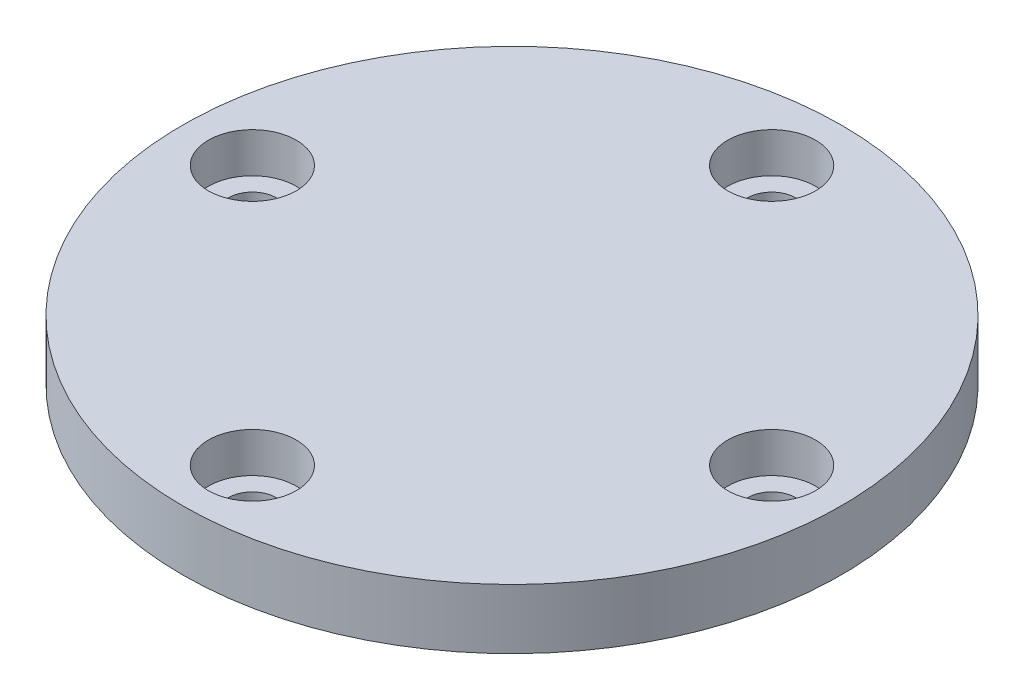
ISO-10303-21;
HEADER;
FILE_DESCRIPTION(('STEP AP214'),'2;1');
FILE_NAME('part.step','',(''),(''),'','','');
FILE_SCHEMA(('AUTOMOTIVE_DESIGN { 1 0 10303 214 1 1 1 1 }'));
ENDSEC;
DATA;
#1=APPLICATION_CONTEXT('core data for automotive mechanical design processes');
#2=APPLICATION_PROTOCOL_DEFINITION('international standard','automotive_design',2000,#1);
#3=PRODUCT_CONTEXT('',#1,'mechanical');
#4=PRODUCT('Part','Part','',(#3));
#5=PRODUCT_RELATED_PRODUCT_CATEGORY('part','',(#4));
#6=PRODUCT_DEFINITION_FORMATION('','',#4);
#7=PRODUCT_DEFINITION_CONTEXT('part definition',#1,'design');
#8=PRODUCT_DEFINITION('design','',#6,#7);
#9=PRODUCT_DEFINITION_SHAPE('','',#8);
#10=(LENGTH_UNIT() NAMED_UNIT(*) SI_UNIT(.MILLI.,.METRE.));
#11=(NAMED_UNIT(*) PLANE_ANGLE_UNIT() SI_UNIT($,.RADIAN.));
#12=(NAMED_UNIT(*) SI_UNIT($,.STERADIAN.) SOLID_ANGLE_UNIT());
#13=UNCERTAINTY_MEASURE_WITH_UNIT(LENGTH_MEASURE(1.E-05),#10,'distance_accuracy_value','');
#14=(GEOMETRIC_REPRESENTATION_CONTEXT(3) GLOBAL_UNCERTAINTY_ASSIGNED_CONTEXT((#13)) GLOBAL_UNIT_ASSIGNED_CONTEXT((#10,
#11,#12)) REPRESENTATION_CONTEXT('',''));
#15=CARTESIAN_POINT('',(0.,0.,0.));
#16=DIRECTION('',(0.,0.,1.));
#17=DIRECTION('',(1.,0.,0.));
#18=AXIS2_PLACEMENT_3D('',#15,#16,#17);
#19=CARTESIAN_POINT('',(0.,3.,0.));
#20=DIRECTION('',(0.,-1.,0.));
#21=DIRECTION('',(0.,0.,-1.));
#22=AXIS2_PLACEMENT_3D('',#19,#20,#21);
#23=CYLINDRICAL_SURFACE('',#22,16.5);
#24=CARTESIAN_POINT('',(0.,3.,0.));
#25=DIRECTION('',(0.,1.,0.));
#26=DIRECTION('',(0.,0.,1.));
#27=AXIS2_PLACEMENT_3D('',#24,#25,#26);
#28=CIRCLE('',#27,16.5);
#29=CARTESIAN_POINT('',(0.,3.,16.5));
#30=VERTEX_POINT('',#29);
#31=EDGE_CURVE('E10',#30,#30,#28,.T.);
#32=ORIENTED_EDGE('',*,*,#31,.F.);
#33=EDGE_LOOP('',(#32));
#34=FACE_BOUND('',#33,.T.);
#35=CARTESIAN_POINT('',(0.,0.,0.));
#36=DIRECTION('',(0.,1.,0.));
#37=DIRECTION('',(0.,0.,1.));
#38=AXIS2_PLACEMENT_3D('',#35,#36,#37);
#39=CIRCLE('',#38,16.5);
#40=CARTESIAN_POINT('',(0.,0.,16.5));
#41=VERTEX_POINT('',#40);
#42=EDGE_CURVE('E37',#41,#41,#39,.T.);
#43=ORIENTED_EDGE('',*,*,#42,.T.);
#44=EDGE_LOOP('',(#43));
#45=FACE_BOUND('',#44,.T.);
#46=ADVANCED_FACE('F34',(#34,#45),#23,.T.);
#47=CARTESIAN_POINT('',(0.,3.,0.));
#48=DIRECTION('',(0.,1.,0.));
#49=DIRECTION('',(0.,0.,1.));
#50=AXIS2_PLACEMENT_3D('',#47,#48,#49);
#51=PLANE('',#50);
#52=CARTESIAN_POINT('',(0.,3.,13.));
#53=DIRECTION('',(0.,1.,0.));
#54=DIRECTION('',(1.,0.,0.));
#55=AXIS2_PLACEMENT_3D('',#52,#53,#54);
#56=CIRCLE('',#55,2.19999999999999);
#57=CARTESIAN_POINT('',(2.20000000000004,3.,13.));
#58=VERTEX_POINT('',#57);
#59=EDGE_CURVE('E74',#58,#58,#56,.T.);
#60=ORIENTED_EDGE('',*,*,#59,.F.);
#61=EDGE_LOOP('',(#60));
#62=FACE_BOUND('',#61,.T.);
#63=CARTESIAN_POINT('',(13.,3.,0.));
#64=DIRECTION('',(0.,1.,0.));
#65=DIRECTION('',(0.,0.,-1.));
#66=AXIS2_PLACEMENT_3D('',#63,#64,#65);
#67=CIRCLE('',#66,2.19999999999999);
#68=CARTESIAN_POINT('',(13.,3.,-2.19999999999999));
#69=VERTEX_POINT('',#68);
#70=EDGE_CURVE('E61',#69,#69,#67,.T.);
#71=ORIENTED_EDGE('',*,*,#70,.F.);
#72=EDGE_LOOP('',(#71));
#73=FACE_BOUND('',#72,.T.);
#74=CARTESIAN_POINT('',(-1.36167772214882E-13,3.,-13.));
#75=DIRECTION('',(0.,1.,0.));
#76=DIRECTION('',(-1.,0.,0.));
#77=AXIS2_PLACEMENT_3D('',#74,#75,#76);
#78=CIRCLE('',#77,2.19999999999999);
#79=CARTESIAN_POINT('',(-2.20000000000013,3.,-13.));
#80=VERTEX_POINT('',#79);
#81=EDGE_CURVE('E68',#80,#80,#78,.T.);
#82=ORIENTED_EDGE('',*,*,#81,.F.);
#83=EDGE_LOOP('',(#82));
#84=FACE_BOUND('',#83,.T.);
#85=CARTESIAN_POINT('',(-13.,3.,0.));
#86=DIRECTION('',(0.,1.,0.));
#87=DIRECTION('',(0.,0.,1.));
#88=AXIS2_PLACEMENT_3D('',#85,#86,#87);
#89=CIRCLE('',#88,2.19999999999999);
#90=CARTESIAN_POINT('',(-13.,3.,2.19999999999999));
#91=VERTEX_POINT('',#90);
#92=EDGE_CURVE('E54',#91,#91,#89,.T.);
#93=ORIENTED_EDGE('',*,*,#92,.F.);
#94=EDGE_LOOP('',(#93));
#95=FACE_BOUND('',#94,.T.);
#96=ORIENTED_EDGE('',*,*,#31,.T.);
#97=EDGE_LOOP('',(#96));
#98=FACE_BOUND('',#97,.T.);
#99=ADVANCED_FACE('F96',(#62,#73,#84,#95,#98),#51,.T.);
#100=CARTESIAN_POINT('',(0.,0.,0.));
#101=DIRECTION('',(0.,1.,0.));
#102=DIRECTION('',(0.,0.,1.));
#103=AXIS2_PLACEMENT_3D('',#100,#101,#102);
#104=PLANE('',#103);
#105=CARTESIAN_POINT('',(0.,0.,13.));
#106=DIRECTION('',(0.,1.,0.));
#107=DIRECTION('',(1.,0.,0.));
#108=AXIS2_PLACEMENT_3D('',#105,#106,#107);
#109=CIRCLE('',#108,1.2);
#110=CARTESIAN_POINT('',(1.20000000000005,0.,13.));
#111=VERTEX_POINT('',#110);
#112=EDGE_CURVE('E88',#111,#111,#109,.T.);
#113=ORIENTED_EDGE('',*,*,#112,.T.);
#114=EDGE_LOOP('',(#113));
#115=FACE_BOUND('',#114,.T.);
#116=CARTESIAN_POINT('',(13.,0.,0.));
#117=DIRECTION('',(0.,1.,0.));
#118=DIRECTION('',(0.,0.,-1.));
#119=AXIS2_PLACEMENT_3D('',#116,#117,#118);
#120=CIRCLE('',#119,1.2);
#121=CARTESIAN_POINT('',(13.,0.,-1.2));
#122=VERTEX_POINT('',#121);
#123=EDGE_CURVE('E78',#122,#122,#120,.T.);
#124=ORIENTED_EDGE('',*,*,#123,.T.);
#125=EDGE_LOOP('',(#124));
#126=FACE_BOUND('',#125,.T.);
#127=CARTESIAN_POINT('',(-1.36167772214882E-13,0.,-13.));
#128=DIRECTION('',(0.,1.,0.));
#129=DIRECTION('',(-1.,0.,0.));
#130=AXIS2_PLACEMENT_3D('',#127,#128,#129);
#131=CIRCLE('',#130,1.2);
#132=CARTESIAN_POINT('',(-1.20000000000014,0.,-13.));
#133=VERTEX_POINT('',#132);
#134=EDGE_CURVE('E65',#133,#133,#131,.T.);
#135=ORIENTED_EDGE('',*,*,#134,.T.);
#136=EDGE_LOOP('',(#135));
#137=FACE_BOUND('',#136,.T.);
#138=CARTESIAN_POINT('',(-13.,0.,0.));
#139=DIRECTION('',(0.,1.,0.));
#140=DIRECTION('',(0.,0.,1.));
#141=AXIS2_PLACEMENT_3D('',#138,#139,#140);
#142=CIRCLE('',#141,1.2);
#143=CARTESIAN_POINT('',(-13.,0.,1.2));
#144=VERTEX_POINT('',#143);
#145=EDGE_CURVE('E44',#144,#144,#142,.T.);
#146=ORIENTED_EDGE('',*,*,#145,.T.);
#147=EDGE_LOOP('',(#146));
#148=FACE_BOUND('',#147,.T.);
#149=ORIENTED_EDGE('',*,*,#42,.F.);
#150=EDGE_LOOP('',(#149));
#151=FACE_BOUND('',#150,.T.);
#152=ADVANCED_FACE('F99',(#115,#126,#137,#148,#151),#104,.F.);
#153=CARTESIAN_POINT('',(-13.,3.,0.));
#154=DIRECTION('',(0.,1.,0.));
#155=DIRECTION('',(0.,0.,1.));
#156=AXIS2_PLACEMENT_3D('',#153,#154,#155);
#157=CYLINDRICAL_SURFACE('',#156,1.20000000000001);
#158=ORIENTED_EDGE('',*,*,#145,.F.);
#159=EDGE_LOOP('',(#158));
#160=FACE_BOUND('',#159,.T.);
#161=CARTESIAN_POINT('',(-13.,0.999999999999998,0.));
#162=DIRECTION('',(0.,1.,0.));
#163=DIRECTION('',(0.,0.,1.));
#164=AXIS2_PLACEMENT_3D('',#161,#162,#163);
#165=CIRCLE('',#164,1.20000000000001);
#166=CARTESIAN_POINT('',(-13.,0.999999999999998,1.20000000000001));
#167=VERTEX_POINT('',#166);
#168=EDGE_CURVE('E48',#167,#167,#165,.T.);
#169=ORIENTED_EDGE('',*,*,#168,.T.);
#170=EDGE_LOOP('',(#169));
#171=FACE_BOUND('',#170,.T.);
#172=ADVANCED_FACE('F120',(#160,#171),#157,.F.);
#173=CARTESIAN_POINT('',(-11.8,0.999999999999998,0.));
#174=DIRECTION('',(0.,-1.,0.));
#175=DIRECTION('',(0.,0.,-1.));
#176=AXIS2_PLACEMENT_3D('',#173,#174,#175);
#177=PLANE('',#176);
#178=ORIENTED_EDGE('',*,*,#168,.F.);
#179=EDGE_LOOP('',(#178));
#180=FACE_BOUND('',#179,.T.);
#181=CARTESIAN_POINT('',(-13.,0.999999999999998,0.));
#182=DIRECTION('',(0.,1.,0.));
#183=DIRECTION('',(0.,0.,1.));
#184=AXIS2_PLACEMENT_3D('',#181,#182,#183);
#185=CIRCLE('',#184,2.19999999999999);
#186=CARTESIAN_POINT('',(-13.,0.999999999999998,2.19999999999999));
#187=VERTEX_POINT('',#186);
#188=EDGE_CURVE('E51',#187,#187,#185,.T.);
#189=ORIENTED_EDGE('',*,*,#188,.T.);
#190=EDGE_LOOP('',(#189));
#191=FACE_BOUND('',#190,.T.);
#192=ADVANCED_FACE('F110',(#180,#191),#177,.F.);
#193=CARTESIAN_POINT('',(-13.,3.,0.));
#194=DIRECTION('',(0.,1.,0.));
#195=DIRECTION('',(0.,0.,1.));
#196=AXIS2_PLACEMENT_3D('',#193,#194,#195);
#197=CYLINDRICAL_SURFACE('',#196,2.19999999999999);
#198=ORIENTED_EDGE('',*,*,#188,.F.);
#199=EDGE_LOOP('',(#198));
#200=FACE_BOUND('',#199,.T.);
#201=ORIENTED_EDGE('',*,*,#92,.T.);
#202=EDGE_LOOP('',(#201));
#203=FACE_BOUND('',#202,.T.);
#204=ADVANCED_FACE('F107',(#200,#203),#197,.F.);
#205=CARTESIAN_POINT('',(-1.36167772214882E-13,3.,-13.));
#206=DIRECTION('',(0.,1.,0.));
#207=DIRECTION('',(-1.,0.,0.));
#208=AXIS2_PLACEMENT_3D('',#205,#206,#207);
#209=CYLINDRICAL_SURFACE('',#208,1.20000000000001);
#210=ORIENTED_EDGE('',*,*,#134,.F.);
#211=EDGE_LOOP('',(#210));
#212=FACE_BOUND('',#211,.T.);
#213=CARTESIAN_POINT('',(-1.36167772214882E-13,0.999999999999998,-13.));
#214=DIRECTION('',(0.,1.,0.));
#215=DIRECTION('',(-1.,0.,0.));
#216=AXIS2_PLACEMENT_3D('',#213,#214,#215);
#217=CIRCLE('',#216,1.20000000000001);
#218=CARTESIAN_POINT('',(-1.20000000000015,0.999999999999998,-13.));
#219=VERTEX_POINT('',#218);
#220=EDGE_CURVE('E58',#219,#219,#217,.T.);
#221=ORIENTED_EDGE('',*,*,#220,.T.);
#222=EDGE_LOOP('',(#221));
#223=FACE_BOUND('',#222,.T.);
#224=ADVANCED_FACE('F109',(#212,#223),#209,.F.);
#225=CARTESIAN_POINT('',(-1.23598439395047E-13,0.999999999999998,-11.8));
#226=DIRECTION('',(0.,-1.,0.));
#227=DIRECTION('',(1.,0.,0.));
#228=AXIS2_PLACEMENT_3D('',#225,#226,#227);
#229=PLANE('',#228);
#230=ORIENTED_EDGE('',*,*,#220,.F.);
#231=EDGE_LOOP('',(#230));
#232=FACE_BOUND('',#231,.T.);
#233=CARTESIAN_POINT('',(-1.36167772214882E-13,0.999999999999998,-13.));
#234=DIRECTION('',(0.,1.,0.));
#235=DIRECTION('',(-1.,0.,0.));
#236=AXIS2_PLACEMENT_3D('',#233,#234,#235);
#237=CIRCLE('',#236,2.19999999999999);
#238=CARTESIAN_POINT('',(-2.20000000000013,0.999999999999998,-13.));
#239=VERTEX_POINT('',#238);
#240=EDGE_CURVE('E62',#239,#239,#237,.T.);
#241=ORIENTED_EDGE('',*,*,#240,.T.);
#242=EDGE_LOOP('',(#241));
#243=FACE_BOUND('',#242,.T.);
#244=ADVANCED_FACE('F117',(#232,#243),#229,.F.);
#245=CARTESIAN_POINT('',(-1.36167772214882E-13,3.,-13.));
#246=DIRECTION('',(0.,1.,0.));
#247=DIRECTION('',(-1.,0.,0.));
#248=AXIS2_PLACEMENT_3D('',#245,#246,#247);
#249=CYLINDRICAL_SURFACE('',#248,2.19999999999999);
#250=ORIENTED_EDGE('',*,*,#240,.F.);
#251=EDGE_LOOP('',(#250));
#252=FACE_BOUND('',#251,.T.);
#253=ORIENTED_EDGE('',*,*,#81,.T.);
#254=EDGE_LOOP('',(#253));
#255=FACE_BOUND('',#254,.T.);
#256=ADVANCED_FACE('F153',(#252,#255),#249,.F.);
#257=CARTESIAN_POINT('',(13.,3.,0.));
#258=DIRECTION('',(0.,1.,0.));
#259=DIRECTION('',(0.,0.,-1.));
#260=AXIS2_PLACEMENT_3D('',#257,#258,#259);
#261=CYLINDRICAL_SURFACE('',#260,1.20000000000001);
#262=ORIENTED_EDGE('',*,*,#123,.F.);
#263=EDGE_LOOP('',(#262));
#264=FACE_BOUND('',#263,.T.);
#265=CARTESIAN_POINT('',(13.,0.999999999999998,0.));
#266=DIRECTION('',(0.,1.,0.));
#267=DIRECTION('',(0.,0.,-1.));
#268=AXIS2_PLACEMENT_3D('',#265,#266,#267);
#269=CIRCLE('',#268,1.20000000000001);
#270=CARTESIAN_POINT('',(13.,0.999999999999998,-1.20000000000001));
#271=VERTEX_POINT('',#270);
#272=EDGE_CURVE('E71',#271,#271,#269,.T.);
#273=ORIENTED_EDGE('',*,*,#272,.T.);
#274=EDGE_LOOP('',(#273));
#275=FACE_BOUND('',#274,.T.);
#276=ADVANCED_FACE('F159',(#264,#275),#261,.F.);
#277=CARTESIAN_POINT('',(11.8,0.999999999999998,0.));
#278=DIRECTION('',(0.,-1.,0.));
#279=DIRECTION('',(0.,0.,1.));
#280=AXIS2_PLACEMENT_3D('',#277,#278,#279);
#281=PLANE('',#280);
#282=ORIENTED_EDGE('',*,*,#272,.F.);
#283=EDGE_LOOP('',(#282));
#284=FACE_BOUND('',#283,.T.);
#285=CARTESIAN_POINT('',(13.,0.999999999999998,0.));
#286=DIRECTION('',(0.,1.,0.));
#287=DIRECTION('',(0.,0.,-1.));
#288=AXIS2_PLACEMENT_3D('',#285,#286,#287);
#289=CIRCLE('',#288,2.19999999999999);
#290=CARTESIAN_POINT('',(13.,0.999999999999998,-2.19999999999999));
#291=VERTEX_POINT('',#290);
#292=EDGE_CURVE('E75',#291,#291,#289,.T.);
#293=ORIENTED_EDGE('',*,*,#292,.T.);
#294=EDGE_LOOP('',(#293));
#295=FACE_BOUND('',#294,.T.);
#296=ADVANCED_FACE('F164',(#284,#295),#281,.F.);
#297=CARTESIAN_POINT('',(13.,3.,0.));
#298=DIRECTION('',(0.,1.,0.));
#299=DIRECTION('',(0.,0.,-1.));
#300=AXIS2_PLACEMENT_3D('',#297,#298,#299);
#301=CYLINDRICAL_SURFACE('',#300,2.19999999999999);
#302=ORIENTED_EDGE('',*,*,#292,.F.);
#303=EDGE_LOOP('',(#302));
#304=FACE_BOUND('',#303,.T.);
#305=ORIENTED_EDGE('',*,*,#70,.T.);
#306=EDGE_LOOP('',(#305));
#307=FACE_BOUND('',#306,.T.);
#308=ADVANCED_FACE('F170',(#304,#307),#301,.F.);
#309=CARTESIAN_POINT('',(0.,3.,13.));
#310=DIRECTION('',(0.,1.,0.));
#311=DIRECTION('',(1.,0.,0.));
#312=AXIS2_PLACEMENT_3D('',#309,#310,#311);
#313=CYLINDRICAL_SURFACE('',#312,1.20000000000001);
#314=ORIENTED_EDGE('',*,*,#112,.F.);
#315=EDGE_LOOP('',(#314));
#316=FACE_BOUND('',#315,.T.);
#317=CARTESIAN_POINT('',(0.,0.999999999999998,13.));
#318=DIRECTION('',(0.,1.,0.));
#319=DIRECTION('',(1.,0.,0.));
#320=AXIS2_PLACEMENT_3D('',#317,#318,#319);
#321=CIRCLE('',#320,1.20000000000001);
#322=CARTESIAN_POINT('',(1.20000000000006,0.999999999999998,13.));
#323=VERTEX_POINT('',#322);
#324=EDGE_CURVE('E57',#323,#323,#321,.T.);
#325=ORIENTED_EDGE('',*,*,#324,.T.);
#326=EDGE_LOOP('',(#325));
#327=FACE_BOUND('',#326,.T.);
#328=ADVANCED_FACE('F174',(#316,#327),#313,.F.);
#329=CARTESIAN_POINT('',(0.,0.999999999999998,11.8));
#330=DIRECTION('',(0.,-1.,0.));
#331=DIRECTION('',(-1.,0.,0.));
#332=AXIS2_PLACEMENT_3D('',#329,#330,#331);
#333=PLANE('',#332);
#334=ORIENTED_EDGE('',*,*,#324,.F.);
#335=EDGE_LOOP('',(#334));
#336=FACE_BOUND('',#335,.T.);
#337=CARTESIAN_POINT('',(0.,0.999999999999998,13.));
#338=DIRECTION('',(0.,1.,0.));
#339=DIRECTION('',(1.,0.,0.));
#340=AXIS2_PLACEMENT_3D('',#337,#338,#339);
#341=CIRCLE('',#340,2.19999999999999);
#342=CARTESIAN_POINT('',(2.20000000000004,0.999999999999998,13.));
#343=VERTEX_POINT('',#342);
#344=EDGE_CURVE('E85',#343,#343,#341,.T.);
#345=ORIENTED_EDGE('',*,*,#344,.T.);
#346=EDGE_LOOP('',(#345));
#347=FACE_BOUND('',#346,.T.);
#348=ADVANCED_FACE('F178',(#336,#347),#333,.F.);
#349=CARTESIAN_POINT('',(0.,3.,13.));
#350=DIRECTION('',(0.,1.,0.));
#351=DIRECTION('',(1.,0.,0.));
#352=AXIS2_PLACEMENT_3D('',#349,#350,#351);
#353=CYLINDRICAL_SURFACE('',#352,2.19999999999999);
#354=ORIENTED_EDGE('',*,*,#344,.F.);
#355=EDGE_LOOP('',(#354));
#356=FACE_BOUND('',#355,.T.);
#357=ORIENTED_EDGE('',*,*,#59,.T.);
#358=EDGE_LOOP('',(#357));
#359=FACE_BOUND('',#358,.T.);
#360=ADVANCED_FACE('F94',(#356,#359),#353,.F.);
#361=CLOSED_SHELL('',(#46,#99,#152,#172,#192,#204,#224,#244,#256,#276,#296,#308,#328,#348,#360));
#362=MANIFOLD_SOLID_BREP('B2',#361);
#363=ADVANCED_BREP_SHAPE_REPRESENTATION('',(#18,#362),#14);
#364=SHAPE_DEFINITION_REPRESENTATION(#9,#363);
ENDSEC;
END-ISO-10303-21;
